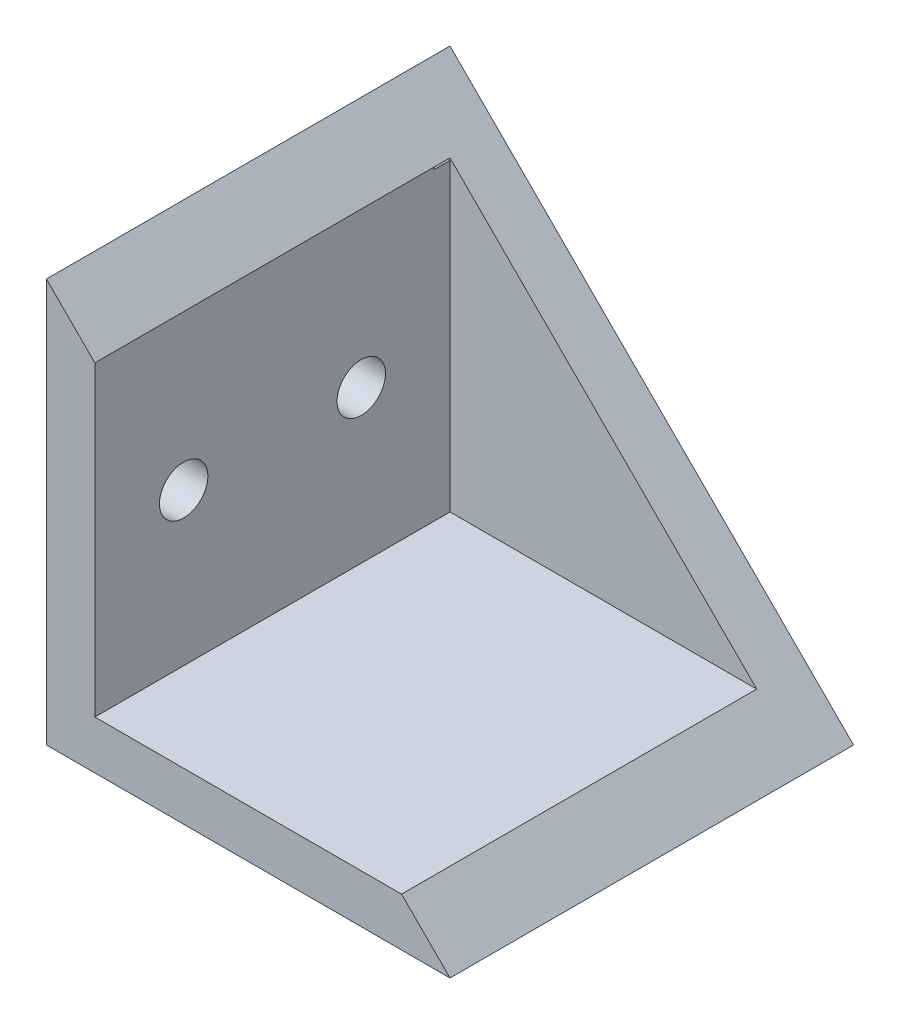
ISO-10303-21;
HEADER;
FILE_DESCRIPTION(('STEP AP214'),'2;1');
FILE_NAME('part.step','',(''),(''),'','','');
FILE_SCHEMA(('AUTOMOTIVE_DESIGN { 1 0 10303 214 1 1 1 1 }'));
ENDSEC;
DATA;
#1=APPLICATION_CONTEXT('core data for automotive mechanical design processes');
#2=APPLICATION_PROTOCOL_DEFINITION('international standard','automotive_design',2000,#1);
#3=PRODUCT_CONTEXT('',#1,'mechanical');
#4=PRODUCT('Part','Part','',(#3));
#5=PRODUCT_RELATED_PRODUCT_CATEGORY('part','',(#4));
#6=PRODUCT_DEFINITION_FORMATION('','',#4);
#7=PRODUCT_DEFINITION_CONTEXT('part definition',#1,'design');
#8=PRODUCT_DEFINITION('design','',#6,#7);
#9=PRODUCT_DEFINITION_SHAPE('','',#8);
#10=(LENGTH_UNIT() NAMED_UNIT(*) SI_UNIT(.MILLI.,.METRE.));
#11=(NAMED_UNIT(*) PLANE_ANGLE_UNIT() SI_UNIT($,.RADIAN.));
#12=(NAMED_UNIT(*) SI_UNIT($,.STERADIAN.) SOLID_ANGLE_UNIT());
#13=UNCERTAINTY_MEASURE_WITH_UNIT(LENGTH_MEASURE(1.E-05),#10,'distance_accuracy_value','');
#14=(GEOMETRIC_REPRESENTATION_CONTEXT(3) GLOBAL_UNCERTAINTY_ASSIGNED_CONTEXT((#13)) GLOBAL_UNIT_ASSIGNED_CONTEXT((#10,
#11,#12)) REPRESENTATION_CONTEXT('',''));
#15=CARTESIAN_POINT('',(0.,0.,0.));
#16=DIRECTION('',(0.,0.,1.));
#17=DIRECTION('',(1.,0.,0.));
#18=AXIS2_PLACEMENT_3D('',#15,#16,#17);
#19=CARTESIAN_POINT('',(21.9292893218814,2.23675299317805,3.));
#20=DIRECTION('',(0.,0.,-1.));
#21=DIRECTION('',(-1.,0.,0.));
#22=AXIS2_PLACEMENT_3D('',#19,#20,#21);
#23=PLANE('',#22);
#24=DIRECTION('',(1.,0.,0.));
#25=VECTOR('',#24,1.);
#26=CARTESIAN_POINT('',(3.00000000000001,2.30746367129671,3.));
#27=LINE('',#26,#25);
#28=CARTESIAN_POINT('',(3.00000000000001,2.30746367129671,3.));
#29=VERTEX_POINT('',#28);
#30=CARTESIAN_POINT('',(22.,2.30746367129671,3.));
#31=VERTEX_POINT('',#30);
#32=EDGE_CURVE('E116',#29,#31,#27,.T.);
#33=ORIENTED_EDGE('',*,*,#32,.T.);
#34=DIRECTION('',(-0.707106781186547,0.707106781186548,0.));
#35=VECTOR('',#34,1.);
#36=CARTESIAN_POINT('',(22.,2.30746367129671,3.));
#37=LINE('',#36,#35);
#38=CARTESIAN_POINT('',(3.00000000000001,21.3074636712967,3.));
#39=VERTEX_POINT('',#38);
#40=EDGE_CURVE('E129',#31,#39,#37,.T.);
#41=ORIENTED_EDGE('',*,*,#40,.T.);
#42=DIRECTION('',(0.707106781186548,0.707106781186548,0.));
#43=VECTOR('',#42,1.);
#44=CARTESIAN_POINT('',(2.92928932188135,21.2367529931781,3.));
#45=LINE('',#44,#43);
#46=CARTESIAN_POINT('',(2.92928932188135,21.2367529931781,3.));
#47=VERTEX_POINT('',#46);
#48=EDGE_CURVE('E146',#47,#39,#45,.T.);
#49=ORIENTED_EDGE('',*,*,#48,.F.);
#50=DIRECTION('',(-0.707106781186547,0.707106781186548,0.));
#51=VECTOR('',#50,1.);
#52=CARTESIAN_POINT('',(21.9292893218814,2.23675299317805,3.));
#53=LINE('',#52,#51);
#54=CARTESIAN_POINT('',(3.00000000000001,21.1660423150594,3.));
#55=VERTEX_POINT('',#54);
#56=EDGE_CURVE('E137',#55,#47,#53,.T.);
#57=ORIENTED_EDGE('',*,*,#56,.F.);
#58=DIRECTION('',(0.,-1.,0.));
#59=VECTOR('',#58,1.);
#60=CARTESIAN_POINT('',(3.00000000000001,21.3074636712967,3.));
#61=LINE('',#60,#59);
#62=EDGE_CURVE('E132',#55,#29,#61,.T.);
#63=ORIENTED_EDGE('',*,*,#62,.T.);
#64=EDGE_LOOP('',(#33,#41,#49,#57,#63));
#65=FACE_BOUND('',#64,.T.);
#66=ADVANCED_FACE('F33',(#65),#23,.F.);
#67=CARTESIAN_POINT('',(12.0830211575297,12.0830211575297,0.));
#68=DIRECTION('',(0.707106781186548,0.707106781186547,0.));
#69=DIRECTION('',(-0.707106781186547,0.707106781186548,0.));
#70=AXIS2_PLACEMENT_3D('',#67,#68,#69);
#71=PLANE('',#70);
#72=DIRECTION('',(0.,0.,1.));
#73=VECTOR('',#72,1.);
#74=CARTESIAN_POINT('',(3.,21.1660423150594,0.));
#75=LINE('',#74,#73);
#76=CARTESIAN_POINT('',(3.00000000000001,21.1660423150594,4.));
#77=VERTEX_POINT('',#76);
#78=EDGE_CURVE('E11',#55,#77,#75,.T.);
#79=ORIENTED_EDGE('',*,*,#78,.F.);
#80=ORIENTED_EDGE('',*,*,#56,.T.);
#81=DIRECTION('',(0.,0.,1.));
#82=VECTOR('',#81,1.);
#83=CARTESIAN_POINT('',(2.92928932188135,21.2367529931781,3.));
#84=LINE('',#83,#82);
#85=CARTESIAN_POINT('',(2.92928932188135,21.2367529931781,4.));
#86=VERTEX_POINT('',#85);
#87=EDGE_CURVE('E185',#47,#86,#84,.T.);
#88=ORIENTED_EDGE('',*,*,#87,.T.);
#89=DIRECTION('',(0.707106781186547,-0.707106781186548,0.));
#90=VECTOR('',#89,1.);
#91=CARTESIAN_POINT('',(2.92928932188135,21.2367529931781,4.));
#92=LINE('',#91,#90);
#93=EDGE_CURVE('E140',#86,#77,#92,.T.);
#94=ORIENTED_EDGE('',*,*,#93,.T.);
#95=EDGE_LOOP('',(#79,#80,#88,#94));
#96=FACE_BOUND('',#95,.T.);
#97=ADVANCED_FACE('F192',(#96),#71,.T.);
#98=CARTESIAN_POINT('',(0.,24.3074636712967,25.));
#99=DIRECTION('',(-0.707106781186547,-0.707106781186547,0.));
#100=DIRECTION('',(0.707106781186548,-0.707106781186548,0.));
#101=AXIS2_PLACEMENT_3D('',#98,#99,#100);
#102=PLANE('',#101);
#103=ORIENTED_EDGE('',*,*,#40,.F.);
#104=DIRECTION('',(0.,0.,1.));
#105=VECTOR('',#104,1.);
#106=CARTESIAN_POINT('',(22.,2.30746367129671,4.));
#107=LINE('',#106,#105);
#108=CARTESIAN_POINT('',(22.,2.30746367129671,25.));
#109=VERTEX_POINT('',#108);
#110=EDGE_CURVE('E113',#31,#109,#107,.T.);
#111=ORIENTED_EDGE('',*,*,#110,.T.);
#112=DIRECTION('',(-0.707106781186547,0.707106781186547,0.));
#113=VECTOR('',#112,1.);
#114=CARTESIAN_POINT('',(0.,24.3074636712967,25.));
#115=LINE('',#114,#113);
#116=CARTESIAN_POINT('',(25.,-0.692536328703293,25.));
#117=VERTEX_POINT('',#116);
#118=EDGE_CURVE('E155',#117,#109,#115,.T.);
#119=ORIENTED_EDGE('',*,*,#118,.F.);
#120=DIRECTION('',(0.,0.,-1.));
#121=VECTOR('',#120,1.);
#122=CARTESIAN_POINT('',(25.,-0.692536328703293,25.));
#123=LINE('',#122,#121);
#124=CARTESIAN_POINT('',(25.,-0.692536328703293,0.));
#125=VERTEX_POINT('',#124);
#126=EDGE_CURVE('E160',#117,#125,#123,.T.);
#127=ORIENTED_EDGE('',*,*,#126,.T.);
#128=DIRECTION('',(-0.707106781186547,0.707106781186547,0.));
#129=VECTOR('',#128,1.);
#130=CARTESIAN_POINT('',(0.,24.3074636712967,0.));
#131=LINE('',#130,#129);
#132=CARTESIAN_POINT('',(0.,24.3074636712967,0.));
#133=VERTEX_POINT('',#132);
#134=EDGE_CURVE('E122',#125,#133,#131,.T.);
#135=ORIENTED_EDGE('',*,*,#134,.T.);
#136=DIRECTION('',(0.,0.,-1.));
#137=VECTOR('',#136,1.);
#138=CARTESIAN_POINT('',(0.,24.3074636712967,25.));
#139=LINE('',#138,#137);
#140=CARTESIAN_POINT('',(0.,24.3074636712967,25.));
#141=VERTEX_POINT('',#140);
#142=EDGE_CURVE('E42',#141,#133,#139,.T.);
#143=ORIENTED_EDGE('',*,*,#142,.F.);
#144=CARTESIAN_POINT('',(3.00000000000001,21.3074636712967,25.));
#145=VERTEX_POINT('',#144);
#146=EDGE_CURVE('E80',#145,#141,#115,.T.);
#147=ORIENTED_EDGE('',*,*,#146,.F.);
#148=DIRECTION('',(0.,0.,1.));
#149=VECTOR('',#148,1.);
#150=CARTESIAN_POINT('',(3.,21.3074636712967,4.));
#151=LINE('',#150,#149);
#152=CARTESIAN_POINT('',(3.00000000000001,21.3074636712967,4.));
#153=VERTEX_POINT('',#152);
#154=EDGE_CURVE('E50',#153,#145,#151,.T.);
#155=ORIENTED_EDGE('',*,*,#154,.F.);
#156=DIRECTION('',(0.,0.,1.));
#157=VECTOR('',#156,1.);
#158=CARTESIAN_POINT('',(3.00000000000001,21.3074636712967,3.));
#159=LINE('',#158,#157);
#160=EDGE_CURVE('E135',#39,#153,#159,.T.);
#161=ORIENTED_EDGE('',*,*,#160,.F.);
#162=EDGE_LOOP('',(#103,#111,#119,#127,#135,#143,#147,#155,#161));
#163=FACE_BOUND('',#162,.T.);
#164=ADVANCED_FACE('F35',(#163),#102,.F.);
#165=CARTESIAN_POINT('',(0.,24.3074636712967,25.));
#166=DIRECTION('',(1.,0.,0.));
#167=DIRECTION('',(0.,1.,0.));
#168=AXIS2_PLACEMENT_3D('',#165,#166,#167);
#169=PLANE('',#168);
#170=CARTESIAN_POINT('',(0.,11.7367529931781,8.5));
#171=DIRECTION('',(1.,0.,0.));
#172=DIRECTION('',(0.,1.,0.));
#173=AXIS2_PLACEMENT_3D('',#170,#171,#172);
#174=CIRCLE('',#173,1.5);
#175=CARTESIAN_POINT('',(0.,13.2367529931781,8.5));
#176=VERTEX_POINT('',#175);
#177=EDGE_CURVE('E180',#176,#176,#174,.F.);
#178=ORIENTED_EDGE('',*,*,#177,.F.);
#179=EDGE_LOOP('',(#178));
#180=FACE_BOUND('',#179,.T.);
#181=CARTESIAN_POINT('',(0.,11.7367529931781,19.5));
#182=DIRECTION('',(1.,0.,0.));
#183=DIRECTION('',(0.,1.,0.));
#184=AXIS2_PLACEMENT_3D('',#181,#182,#183);
#185=CIRCLE('',#184,1.5);
#186=CARTESIAN_POINT('',(0.,13.2367529931781,19.5));
#187=VERTEX_POINT('',#186);
#188=EDGE_CURVE('E172',#187,#187,#185,.F.);
#189=ORIENTED_EDGE('',*,*,#188,.F.);
#190=EDGE_LOOP('',(#189));
#191=FACE_BOUND('',#190,.T.);
#192=DIRECTION('',(0.,-1.,0.));
#193=VECTOR('',#192,1.);
#194=CARTESIAN_POINT('',(0.,24.3074636712967,0.));
#195=LINE('',#194,#193);
#196=CARTESIAN_POINT('',(0.,-0.692536328703293,0.));
#197=VERTEX_POINT('',#196);
#198=EDGE_CURVE('E163',#133,#197,#195,.T.);
#199=ORIENTED_EDGE('',*,*,#198,.T.);
#200=DIRECTION('',(0.,0.,-1.));
#201=VECTOR('',#200,1.);
#202=CARTESIAN_POINT('',(0.,-0.692536328703293,25.));
#203=LINE('',#202,#201);
#204=CARTESIAN_POINT('',(0.,-0.692536328703293,25.));
#205=VERTEX_POINT('',#204);
#206=EDGE_CURVE('E167',#205,#197,#203,.T.);
#207=ORIENTED_EDGE('',*,*,#206,.F.);
#208=DIRECTION('',(0.,-1.,0.));
#209=VECTOR('',#208,1.);
#210=CARTESIAN_POINT('',(0.,24.3074636712967,25.));
#211=LINE('',#210,#209);
#212=EDGE_CURVE('E157',#141,#205,#211,.T.);
#213=ORIENTED_EDGE('',*,*,#212,.F.);
#214=ORIENTED_EDGE('',*,*,#142,.T.);
#215=EDGE_LOOP('',(#199,#207,#213,#214));
#216=FACE_BOUND('',#215,.T.);
#217=ADVANCED_FACE('F199',(#180,#191,#216),#169,.F.);
#218=CARTESIAN_POINT('',(0.,-0.692536328703293,25.));
#219=DIRECTION('',(0.,1.,0.));
#220=DIRECTION('',(0.,0.,1.));
#221=AXIS2_PLACEMENT_3D('',#218,#219,#220);
#222=PLANE('',#221);
#223=DIRECTION('',(1.,0.,0.));
#224=VECTOR('',#223,1.);
#225=CARTESIAN_POINT('',(0.,-0.692536328703293,0.));
#226=LINE('',#225,#224);
#227=EDGE_CURVE('E76',#197,#125,#226,.T.);
#228=ORIENTED_EDGE('',*,*,#227,.T.);
#229=ORIENTED_EDGE('',*,*,#126,.F.);
#230=DIRECTION('',(1.,0.,0.));
#231=VECTOR('',#230,1.);
#232=CARTESIAN_POINT('',(0.,-0.692536328703293,25.));
#233=LINE('',#232,#231);
#234=EDGE_CURVE('E59',#205,#117,#233,.T.);
#235=ORIENTED_EDGE('',*,*,#234,.F.);
#236=ORIENTED_EDGE('',*,*,#206,.T.);
#237=EDGE_LOOP('',(#228,#229,#235,#236));
#238=FACE_BOUND('',#237,.T.);
#239=ADVANCED_FACE('F204',(#238),#222,.F.);
#240=CARTESIAN_POINT('',(0.,0.,25.));
#241=DIRECTION('',(0.,0.,1.));
#242=DIRECTION('',(1.,0.,0.));
#243=AXIS2_PLACEMENT_3D('',#240,#241,#242);
#244=PLANE('',#243);
#245=DIRECTION('',(1.,0.,0.));
#246=VECTOR('',#245,1.);
#247=CARTESIAN_POINT('',(3.00000000000001,2.30746367129671,25.));
#248=LINE('',#247,#246);
#249=CARTESIAN_POINT('',(3.00000000000001,2.30746367129671,25.));
#250=VERTEX_POINT('',#249);
#251=EDGE_CURVE('E118',#250,#109,#248,.T.);
#252=ORIENTED_EDGE('',*,*,#251,.F.);
#253=DIRECTION('',(0.,-1.,0.));
#254=VECTOR('',#253,1.);
#255=CARTESIAN_POINT('',(3.,21.3074636712967,25.));
#256=LINE('',#255,#254);
#257=EDGE_CURVE('E145',#145,#250,#256,.T.);
#258=ORIENTED_EDGE('',*,*,#257,.F.);
#259=ORIENTED_EDGE('',*,*,#146,.T.);
#260=ORIENTED_EDGE('',*,*,#212,.T.);
#261=ORIENTED_EDGE('',*,*,#234,.T.);
#262=ORIENTED_EDGE('',*,*,#118,.T.);
#263=EDGE_LOOP('',(#252,#258,#259,#260,#261,#262));
#264=FACE_BOUND('',#263,.T.);
#265=ADVANCED_FACE('F201',(#264),#244,.T.);
#266=CARTESIAN_POINT('',(0.,0.,0.));
#267=DIRECTION('',(0.,0.,1.));
#268=DIRECTION('',(1.,0.,0.));
#269=AXIS2_PLACEMENT_3D('',#266,#267,#268);
#270=PLANE('',#269);
#271=ORIENTED_EDGE('',*,*,#134,.F.);
#272=ORIENTED_EDGE('',*,*,#227,.F.);
#273=ORIENTED_EDGE('',*,*,#198,.F.);
#274=EDGE_LOOP('',(#271,#272,#273));
#275=FACE_BOUND('',#274,.T.);
#276=ADVANCED_FACE('F203',(#275),#270,.F.);
#277=CARTESIAN_POINT('',(3.00000000000001,2.30746367129671,4.));
#278=DIRECTION('',(0.,-1.,0.));
#279=DIRECTION('',(0.,0.,-1.));
#280=AXIS2_PLACEMENT_3D('',#277,#278,#279);
#281=PLANE('',#280);
#282=ORIENTED_EDGE('',*,*,#110,.F.);
#283=ORIENTED_EDGE('',*,*,#32,.F.);
#284=DIRECTION('',(0.,0.,1.));
#285=VECTOR('',#284,1.);
#286=CARTESIAN_POINT('',(3.00000000000001,2.30746367129671,4.));
#287=LINE('',#286,#285);
#288=EDGE_CURVE('E123',#29,#250,#287,.T.);
#289=ORIENTED_EDGE('',*,*,#288,.T.);
#290=ORIENTED_EDGE('',*,*,#251,.T.);
#291=EDGE_LOOP('',(#282,#283,#289,#290));
#292=FACE_BOUND('',#291,.T.);
#293=ADVANCED_FACE('F115',(#292),#281,.F.);
#294=CARTESIAN_POINT('',(3.,21.3074636712967,4.));
#295=DIRECTION('',(-1.,0.,0.));
#296=DIRECTION('',(0.,-1.,0.));
#297=AXIS2_PLACEMENT_3D('',#294,#295,#296);
#298=PLANE('',#297);
#299=CARTESIAN_POINT('',(3.,11.7367529931781,8.5));
#300=DIRECTION('',(-1.,0.,0.));
#301=DIRECTION('',(0.,-1.,0.));
#302=AXIS2_PLACEMENT_3D('',#299,#300,#301);
#303=CIRCLE('',#302,1.5);
#304=CARTESIAN_POINT('',(3.,10.2367529931781,8.5));
#305=VERTEX_POINT('',#304);
#306=EDGE_CURVE('E37',#305,#305,#303,.F.);
#307=ORIENTED_EDGE('',*,*,#306,.F.);
#308=EDGE_LOOP('',(#307));
#309=FACE_BOUND('',#308,.T.);
#310=CARTESIAN_POINT('',(3.,11.7367529931781,19.5));
#311=DIRECTION('',(-1.,0.,0.));
#312=DIRECTION('',(0.,-1.,0.));
#313=AXIS2_PLACEMENT_3D('',#310,#311,#312);
#314=CIRCLE('',#313,1.5);
#315=CARTESIAN_POINT('',(3.,10.2367529931781,19.5));
#316=VERTEX_POINT('',#315);
#317=EDGE_CURVE('E170',#316,#316,#314,.F.);
#318=ORIENTED_EDGE('',*,*,#317,.F.);
#319=EDGE_LOOP('',(#318));
#320=FACE_BOUND('',#319,.T.);
#321=ORIENTED_EDGE('',*,*,#257,.T.);
#322=ORIENTED_EDGE('',*,*,#288,.F.);
#323=ORIENTED_EDGE('',*,*,#62,.F.);
#324=ORIENTED_EDGE('',*,*,#78,.T.);
#325=DIRECTION('',(0.,-1.,0.));
#326=VECTOR('',#325,1.);
#327=CARTESIAN_POINT('',(3.,21.3074636712967,4.));
#328=LINE('',#327,#326);
#329=EDGE_CURVE('E148',#153,#77,#328,.T.);
#330=ORIENTED_EDGE('',*,*,#329,.F.);
#331=ORIENTED_EDGE('',*,*,#154,.T.);
#332=EDGE_LOOP('',(#321,#322,#323,#324,#330,#331));
#333=FACE_BOUND('',#332,.T.);
#334=ADVANCED_FACE('F195',(#309,#320,#333),#298,.F.);
#335=CARTESIAN_POINT('',(2.92928932188135,21.2367529931781,4.));
#336=DIRECTION('',(0.,0.,1.));
#337=DIRECTION('',(1.,0.,0.));
#338=AXIS2_PLACEMENT_3D('',#335,#336,#337);
#339=PLANE('',#338);
#340=ORIENTED_EDGE('',*,*,#93,.F.);
#341=DIRECTION('',(0.707106781186548,0.707106781186548,0.));
#342=VECTOR('',#341,1.);
#343=CARTESIAN_POINT('',(2.92928932188135,21.2367529931781,4.));
#344=LINE('',#343,#342);
#345=EDGE_CURVE('E143',#86,#153,#344,.T.);
#346=ORIENTED_EDGE('',*,*,#345,.T.);
#347=ORIENTED_EDGE('',*,*,#329,.T.);
#348=EDGE_LOOP('',(#340,#346,#347));
#349=FACE_BOUND('',#348,.T.);
#350=ADVANCED_FACE('F194',(#349),#339,.F.);
#351=CARTESIAN_POINT('',(2.92928932188135,21.2367529931781,3.));
#352=DIRECTION('',(-0.707106781186548,0.707106781186548,0.));
#353=DIRECTION('',(-0.707106781186548,-0.707106781186547,0.));
#354=AXIS2_PLACEMENT_3D('',#351,#352,#353);
#355=PLANE('',#354);
#356=ORIENTED_EDGE('',*,*,#160,.T.);
#357=ORIENTED_EDGE('',*,*,#345,.F.);
#358=ORIENTED_EDGE('',*,*,#87,.F.);
#359=ORIENTED_EDGE('',*,*,#48,.T.);
#360=EDGE_LOOP('',(#356,#357,#358,#359));
#361=FACE_BOUND('',#360,.T.);
#362=ADVANCED_FACE('F222',(#361),#355,.F.);
#363=CARTESIAN_POINT('',(18.,11.7367529931781,19.5));
#364=DIRECTION('',(-1.,0.,0.));
#365=DIRECTION('',(0.,-1.,0.));
#366=AXIS2_PLACEMENT_3D('',#363,#364,#365);
#367=CYLINDRICAL_SURFACE('',#366,1.5);
#368=ORIENTED_EDGE('',*,*,#317,.T.);
#369=EDGE_LOOP('',(#368));
#370=FACE_BOUND('',#369,.T.);
#371=ORIENTED_EDGE('',*,*,#188,.T.);
#372=EDGE_LOOP('',(#371));
#373=FACE_BOUND('',#372,.T.);
#374=ADVANCED_FACE('F238',(#370,#373),#367,.F.);
#375=CARTESIAN_POINT('',(18.,11.7367529931781,8.5));
#376=DIRECTION('',(-1.,0.,0.));
#377=DIRECTION('',(0.,-1.,0.));
#378=AXIS2_PLACEMENT_3D('',#375,#376,#377);
#379=CYLINDRICAL_SURFACE('',#378,1.5);
#380=ORIENTED_EDGE('',*,*,#306,.T.);
#381=EDGE_LOOP('',(#380));
#382=FACE_BOUND('',#381,.T.);
#383=ORIENTED_EDGE('',*,*,#177,.T.);
#384=EDGE_LOOP('',(#383));
#385=FACE_BOUND('',#384,.T.);
#386=ADVANCED_FACE('F235',(#382,#385),#379,.F.);
#387=CLOSED_SHELL('',(#66,#97,#164,#217,#239,#265,#276,#293,#334,#350,#362,#374,#386));
#388=MANIFOLD_SOLID_BREP('B2',#387);
#389=ADVANCED_BREP_SHAPE_REPRESENTATION('',(#18,#388),#14);
#390=SHAPE_DEFINITION_REPRESENTATION(#9,#389);
ENDSEC;
END-ISO-10303-21;
